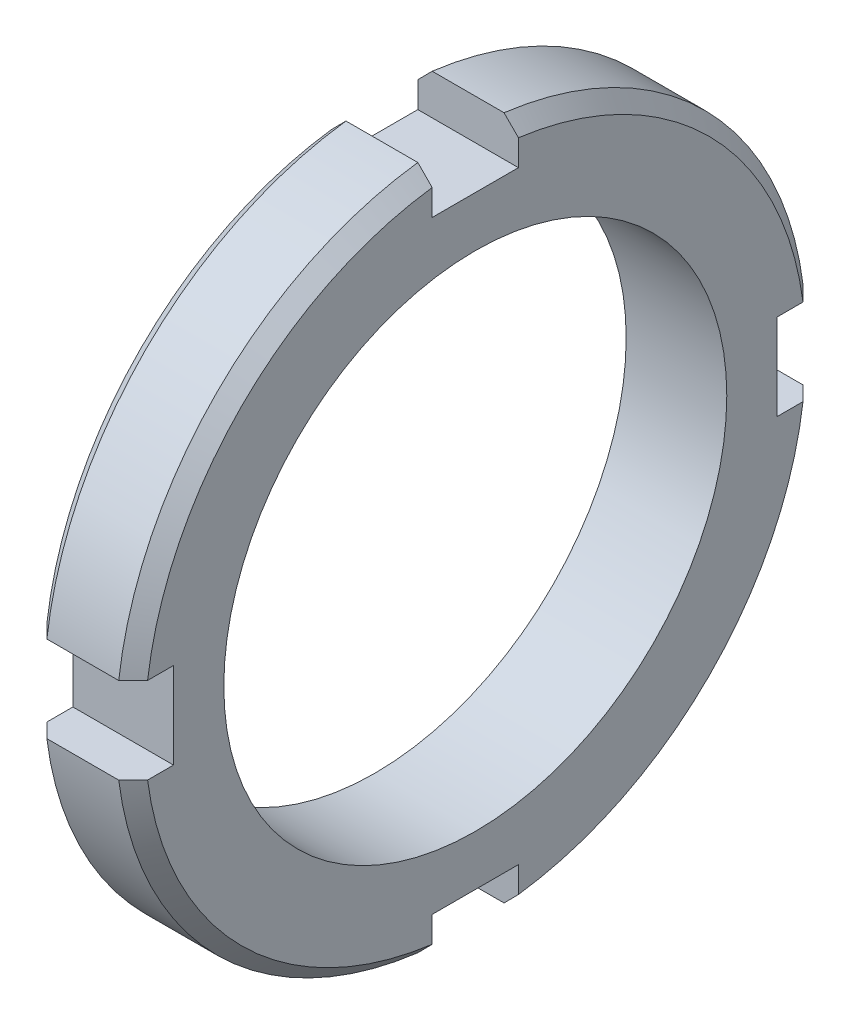
ISO-10303-21;
HEADER;
FILE_DESCRIPTION(('STEP AP214'),'2;1');
FILE_NAME('part.step','',(''),(''),'','','');
FILE_SCHEMA(('AUTOMOTIVE_DESIGN { 1 0 10303 214 1 1 1 1 }'));
ENDSEC;
DATA;
#1=APPLICATION_CONTEXT('core data for automotive mechanical design processes');
#2=APPLICATION_PROTOCOL_DEFINITION('international standard','automotive_design',2000,#1);
#3=PRODUCT_CONTEXT('',#1,'mechanical');
#4=PRODUCT('Part','Part','',(#3));
#5=PRODUCT_RELATED_PRODUCT_CATEGORY('part','',(#4));
#6=PRODUCT_DEFINITION_FORMATION('','',#4);
#7=PRODUCT_DEFINITION_CONTEXT('part definition',#1,'design');
#8=PRODUCT_DEFINITION('design','',#6,#7);
#9=PRODUCT_DEFINITION_SHAPE('','',#8);
#10=(LENGTH_UNIT() NAMED_UNIT(*) SI_UNIT(.MILLI.,.METRE.));
#11=(NAMED_UNIT(*) PLANE_ANGLE_UNIT() SI_UNIT($,.RADIAN.));
#12=(NAMED_UNIT(*) SI_UNIT($,.STERADIAN.) SOLID_ANGLE_UNIT());
#13=UNCERTAINTY_MEASURE_WITH_UNIT(LENGTH_MEASURE(1.E-05),#10,'distance_accuracy_value','');
#14=(GEOMETRIC_REPRESENTATION_CONTEXT(3) GLOBAL_UNCERTAINTY_ASSIGNED_CONTEXT((#13)) GLOBAL_UNIT_ASSIGNED_CONTEXT((#10,
#11,#12)) REPRESENTATION_CONTEXT('',''));
#15=CARTESIAN_POINT('',(0.,0.,0.));
#16=DIRECTION('',(0.,0.,1.));
#17=DIRECTION('',(1.,0.,0.));
#18=AXIS2_PLACEMENT_3D('',#15,#16,#17);
#19=CARTESIAN_POINT('',(0.,17.5,0.));
#20=DIRECTION('',(1.,0.,0.));
#21=DIRECTION('',(0.,0.,-1.));
#22=AXIS2_PLACEMENT_3D('',#19,#20,#21);
#23=PLANE('',#22);
#24=CARTESIAN_POINT('',(0.,0.,0.));
#25=DIRECTION('',(-1.,0.,0.));
#26=DIRECTION('',(0.,0.,1.));
#27=AXIS2_PLACEMENT_3D('',#24,#25,#26);
#28=CIRCLE('',#27,17.5);
#29=CARTESIAN_POINT('',(0.,0.,17.5));
#30=VERTEX_POINT('',#29);
#31=EDGE_CURVE('E211',#30,#30,#28,.T.);
#32=ORIENTED_EDGE('',*,*,#31,.F.);
#33=EDGE_LOOP('',(#32));
#34=FACE_BOUND('',#33,.T.);
#35=DIRECTION('',(0.,0.,1.));
#36=VECTOR('',#35,1.);
#37=CARTESIAN_POINT('',(0.,-3.,0.));
#38=LINE('',#37,#36);
#39=CARTESIAN_POINT('',(0.,-3.,-22.8035085019828));
#40=VERTEX_POINT('',#39);
#41=CARTESIAN_POINT('',(0.,-3.,-21.));
#42=VERTEX_POINT('',#41);
#43=EDGE_CURVE('E258',#40,#42,#38,.T.);
#44=ORIENTED_EDGE('',*,*,#43,.F.);
#45=CARTESIAN_POINT('',(0.,0.,0.));
#46=DIRECTION('',(-1.,0.,0.));
#47=DIRECTION('',(0.,0.,1.));
#48=AXIS2_PLACEMENT_3D('',#45,#46,#47);
#49=CIRCLE('',#48,23.);
#50=CARTESIAN_POINT('',(0.,-22.8035085019828,-3.));
#51=VERTEX_POINT('',#50);
#52=EDGE_CURVE('E300',#40,#51,#49,.T.);
#53=ORIENTED_EDGE('',*,*,#52,.T.);
#54=DIRECTION('',(0.,-1.,0.));
#55=VECTOR('',#54,1.);
#56=CARTESIAN_POINT('',(0.,17.5,-3.));
#57=LINE('',#56,#55);
#58=CARTESIAN_POINT('',(0.,-21.,-3.));
#59=VERTEX_POINT('',#58);
#60=EDGE_CURVE('E504',#59,#51,#57,.T.);
#61=ORIENTED_EDGE('',*,*,#60,.F.);
#62=DIRECTION('',(0.,0.,-1.));
#63=VECTOR('',#62,1.);
#64=CARTESIAN_POINT('',(0.,-21.,0.));
#65=LINE('',#64,#63);
#66=CARTESIAN_POINT('',(0.,-21.,3.));
#67=VERTEX_POINT('',#66);
#68=EDGE_CURVE('E259',#67,#59,#65,.T.);
#69=ORIENTED_EDGE('',*,*,#68,.F.);
#70=DIRECTION('',(0.,1.,0.));
#71=VECTOR('',#70,1.);
#72=CARTESIAN_POINT('',(0.,17.5,3.));
#73=LINE('',#72,#71);
#74=CARTESIAN_POINT('',(0.,-22.8035085019828,3.));
#75=VERTEX_POINT('',#74);
#76=EDGE_CURVE('E218',#75,#67,#73,.T.);
#77=ORIENTED_EDGE('',*,*,#76,.F.);
#78=CARTESIAN_POINT('',(0.,-3.,22.8035085019828));
#79=VERTEX_POINT('',#78);
#80=EDGE_CURVE('E284',#75,#79,#49,.T.);
#81=ORIENTED_EDGE('',*,*,#80,.T.);
#82=DIRECTION('',(0.,0.,1.));
#83=VECTOR('',#82,1.);
#84=CARTESIAN_POINT('',(0.,-3.,0.));
#85=LINE('',#84,#83);
#86=CARTESIAN_POINT('',(0.,-3.,21.));
#87=VERTEX_POINT('',#86);
#88=EDGE_CURVE('E316',#87,#79,#85,.T.);
#89=ORIENTED_EDGE('',*,*,#88,.F.);
#90=DIRECTION('',(0.,-1.,0.));
#91=VECTOR('',#90,1.);
#92=CARTESIAN_POINT('',(0.,17.5,21.));
#93=LINE('',#92,#91);
#94=CARTESIAN_POINT('',(0.,3.,21.));
#95=VERTEX_POINT('',#94);
#96=EDGE_CURVE('E359',#95,#87,#93,.T.);
#97=ORIENTED_EDGE('',*,*,#96,.F.);
#98=DIRECTION('',(0.,0.,-1.));
#99=VECTOR('',#98,1.);
#100=CARTESIAN_POINT('',(0.,3.,0.));
#101=LINE('',#100,#99);
#102=CARTESIAN_POINT('',(0.,3.,22.8035085019828));
#103=VERTEX_POINT('',#102);
#104=EDGE_CURVE('E541',#103,#95,#101,.T.);
#105=ORIENTED_EDGE('',*,*,#104,.F.);
#106=CARTESIAN_POINT('',(0.,22.8035085019828,3.));
#107=VERTEX_POINT('',#106);
#108=EDGE_CURVE('E286',#103,#107,#49,.T.);
#109=ORIENTED_EDGE('',*,*,#108,.T.);
#110=DIRECTION('',(0.,1.,0.));
#111=VECTOR('',#110,1.);
#112=CARTESIAN_POINT('',(0.,17.5,3.));
#113=LINE('',#112,#111);
#114=CARTESIAN_POINT('',(0.,21.,3.));
#115=VERTEX_POINT('',#114);
#116=EDGE_CURVE('E480',#115,#107,#113,.T.);
#117=ORIENTED_EDGE('',*,*,#116,.F.);
#118=DIRECTION('',(0.,0.,1.));
#119=VECTOR('',#118,1.);
#120=CARTESIAN_POINT('',(0.,21.,0.));
#121=LINE('',#120,#119);
#122=CARTESIAN_POINT('',(0.,21.,-3.));
#123=VERTEX_POINT('',#122);
#124=EDGE_CURVE('E494',#123,#115,#121,.T.);
#125=ORIENTED_EDGE('',*,*,#124,.F.);
#126=DIRECTION('',(0.,-1.,0.));
#127=VECTOR('',#126,1.);
#128=CARTESIAN_POINT('',(0.,17.5,-3.));
#129=LINE('',#128,#127);
#130=CARTESIAN_POINT('',(0.,22.8035085019828,-3.));
#131=VERTEX_POINT('',#130);
#132=EDGE_CURVE('E549',#131,#123,#129,.T.);
#133=ORIENTED_EDGE('',*,*,#132,.F.);
#134=CARTESIAN_POINT('',(0.,3.,-22.8035085019828));
#135=VERTEX_POINT('',#134);
#136=EDGE_CURVE('E289',#131,#135,#49,.T.);
#137=ORIENTED_EDGE('',*,*,#136,.T.);
#138=DIRECTION('',(0.,0.,-1.));
#139=VECTOR('',#138,1.);
#140=CARTESIAN_POINT('',(0.,3.,0.));
#141=LINE('',#140,#139);
#142=CARTESIAN_POINT('',(0.,3.,-21.));
#143=VERTEX_POINT('',#142);
#144=EDGE_CURVE('E442',#143,#135,#141,.T.);
#145=ORIENTED_EDGE('',*,*,#144,.F.);
#146=DIRECTION('',(0.,1.,0.));
#147=VECTOR('',#146,1.);
#148=CARTESIAN_POINT('',(0.,17.5,-21.));
#149=LINE('',#148,#147);
#150=EDGE_CURVE('E302',#42,#143,#149,.T.);
#151=ORIENTED_EDGE('',*,*,#150,.F.);
#152=EDGE_LOOP('',(#44,#53,#61,#69,#77,#81,#89,#97,#105,#109,#117,#125,#133,#137,#145,#151));
#153=FACE_BOUND('',#152,.T.);
#154=ADVANCED_FACE('F39',(#34,#153),#23,.F.);
#155=CARTESIAN_POINT('',(1.,0.,0.));
#156=DIRECTION('',(1.,0.,0.));
#157=DIRECTION('',(0.,0.,-1.));
#158=AXIS2_PLACEMENT_3D('',#155,#156,#157);
#159=CONICAL_SURFACE('',#158,24.,0.785398163397449);
#160=CARTESIAN_POINT('',(4.16247766016838,-3.,-26.9962996101159));
#161=CARTESIAN_POINT('',(3.5513634481451,-3.,-26.3814176362449));
#162=CARTESIAN_POINT('',(2.9403713657128,-3.,-25.7664142177015));
#163=CARTESIAN_POINT('',(1.71870574890739,-3.,-24.5360916255063));
#164=CARTESIAN_POINT('',(1.10803221439388,-3.,-23.9207724519938));
#165=CARTESIAN_POINT('',(-0.112922671722353,-3.,-22.6897448260596));
#166=CARTESIAN_POINT('',(-0.72320402325132,-3.,-22.0740363735647));
#167=CARTESIAN_POINT('',(-1.94325481473993,-3.,-20.8421119815848));
#168=CARTESIAN_POINT('',(-2.55302425447197,-3.,-20.2258960418745));
#169=CARTESIAN_POINT('',(-3.16247766016838,-3.,-19.6093674702505));
#170=B_SPLINE_CURVE_WITH_KNOTS('',3,(#160,#161,#162,#163,#164,#165,#166,#167,#168,#169),
.UNSPECIFIED.,.F.,.F.,(4,2,2,2,4),(0.,2.60074297693783,5.20148480668569,7.80222712536961,
10.4029705997262),.UNSPECIFIED.);
#171=CARTESIAN_POINT('',(1.,-3.,-23.8117617995813));
#172=VERTEX_POINT('',#171);
#173=EDGE_CURVE('E303',#172,#40,#170,.T.);
#174=ORIENTED_EDGE('',*,*,#173,.F.);
#175=CARTESIAN_POINT('',(1.,0.,0.));
#176=DIRECTION('',(-1.,0.,0.));
#177=DIRECTION('',(0.,0.,1.));
#178=AXIS2_PLACEMENT_3D('',#175,#176,#177);
#179=CIRCLE('',#178,24.);
#180=CARTESIAN_POINT('',(1.,-23.8117617995813,-3.));
#181=VERTEX_POINT('',#180);
#182=EDGE_CURVE('E602',#172,#181,#179,.T.);
#183=ORIENTED_EDGE('',*,*,#182,.T.);
#184=CARTESIAN_POINT('',(-3.16247766016838,-19.6093674702505,-3.));
#185=CARTESIAN_POINT('',(-2.55302425447197,-20.2258960418745,-3.));
#186=CARTESIAN_POINT('',(-1.94325481473993,-20.8421119815848,-3.));
#187=CARTESIAN_POINT('',(-0.723204023251317,-22.0740363735647,-3.));
#188=CARTESIAN_POINT('',(-0.112922671722349,-22.6897448260596,-3.));
#189=CARTESIAN_POINT('',(1.10803221439388,-23.9207724519938,-3.));
#190=CARTESIAN_POINT('',(1.71870574890739,-24.5360916255063,-3.));
#191=CARTESIAN_POINT('',(2.94037136571281,-25.7664142177015,-3.));
#192=CARTESIAN_POINT('',(3.5513634481451,-26.3814176362449,-3.));
#193=CARTESIAN_POINT('',(4.16247766016838,-26.9962996101159,-3.));
#194=B_SPLINE_CURVE_WITH_KNOTS('',3,(#184,#185,#186,#187,#188,#189,#190,#191,#192,#193),
.UNSPECIFIED.,.F.,.F.,(4,2,2,2,4),(0.,2.60074347435664,5.20148579304056,7.8022276227884,
10.4029705997262),.UNSPECIFIED.);
#195=EDGE_CURVE('E310',#51,#181,#194,.T.);
#196=ORIENTED_EDGE('',*,*,#195,.F.);
#197=ORIENTED_EDGE('',*,*,#52,.F.);
#198=EDGE_LOOP('',(#174,#183,#196,#197));
#199=FACE_BOUND('',#198,.T.);
#200=ADVANCED_FACE('F296',(#199),#159,.T.);
#201=CARTESIAN_POINT('',(-3.16247766016838,3.,-19.6093674702505));
#202=CARTESIAN_POINT('',(-2.55302425447197,3.,-20.2258960418745));
#203=CARTESIAN_POINT('',(-1.94325481473992,3.,-20.8421119815848));
#204=CARTESIAN_POINT('',(-0.723204023251314,3.,-22.0740363735647));
#205=CARTESIAN_POINT('',(-0.112922671722347,3.,-22.6897448260596));
#206=CARTESIAN_POINT('',(1.10803221439389,3.,-23.9207724519938));
#207=CARTESIAN_POINT('',(1.7187057489074,3.,-24.5360916255063));
#208=CARTESIAN_POINT('',(2.94037136571281,3.,-25.7664142177016));
#209=CARTESIAN_POINT('',(3.5513634481451,3.,-26.3814176362449));
#210=CARTESIAN_POINT('',(4.16247766016838,3.,-26.9962996101159));
#211=B_SPLINE_CURVE_WITH_KNOTS('',3,(#201,#202,#203,#204,#205,#206,#207,#208,#209,#210),
.UNSPECIFIED.,.F.,.F.,(4,2,2,2,4),(0.,2.60074347435664,5.20148579304056,7.80222762278841,
10.4029705997262),.UNSPECIFIED.);
#212=CARTESIAN_POINT('',(1.,3.,-23.8117617995813));
#213=VERTEX_POINT('',#212);
#214=EDGE_CURVE('E436',#135,#213,#211,.T.);
#215=ORIENTED_EDGE('',*,*,#214,.F.);
#216=ORIENTED_EDGE('',*,*,#136,.F.);
#217=CARTESIAN_POINT('',(4.16247766016838,26.9962996101159,-3.));
#218=CARTESIAN_POINT('',(3.5513634481451,26.3814176362449,-3.));
#219=CARTESIAN_POINT('',(2.9403713657128,25.7664142177015,-3.));
#220=CARTESIAN_POINT('',(1.71870574890739,24.5360916255063,-3.));
#221=CARTESIAN_POINT('',(1.10803221439388,23.9207724519938,-3.));
#222=CARTESIAN_POINT('',(-0.112922671722353,22.6897448260596,-3.));
#223=CARTESIAN_POINT('',(-0.72320402325132,22.0740363735647,-3.));
#224=CARTESIAN_POINT('',(-1.94325481473993,20.8421119815848,-3.));
#225=CARTESIAN_POINT('',(-2.55302425447197,20.2258960418745,-3.));
#226=CARTESIAN_POINT('',(-3.16247766016838,19.6093674702505,-3.));
#227=B_SPLINE_CURVE_WITH_KNOTS('',3,(#217,#218,#219,#220,#221,#222,#223,#224,#225,#226),
.UNSPECIFIED.,.F.,.F.,(4,2,2,2,4),(0.,2.60074297693783,5.20148480668569,7.80222712536961,
10.4029705997262),.UNSPECIFIED.);
#228=CARTESIAN_POINT('',(1.,23.8117617995813,-3.));
#229=VERTEX_POINT('',#228);
#230=EDGE_CURVE('E550',#229,#131,#227,.T.);
#231=ORIENTED_EDGE('',*,*,#230,.F.);
#232=EDGE_CURVE('E285',#229,#213,#179,.T.);
#233=ORIENTED_EDGE('',*,*,#232,.T.);
#234=EDGE_LOOP('',(#215,#216,#231,#233));
#235=FACE_BOUND('',#234,.T.);
#236=ADVANCED_FACE('F568',(#235),#159,.T.);
#237=CARTESIAN_POINT('',(-3.16247766016838,-3.,19.6093674702505));
#238=CARTESIAN_POINT('',(-2.55302425447197,-3.,20.2258960418745));
#239=CARTESIAN_POINT('',(-1.94325481473993,-3.,20.8421119815848));
#240=CARTESIAN_POINT('',(-0.723204023251317,-3.,22.0740363735647));
#241=CARTESIAN_POINT('',(-0.112922671722349,-3.,22.6897448260596));
#242=CARTESIAN_POINT('',(1.10803221439388,-3.,23.9207724519938));
#243=CARTESIAN_POINT('',(1.71870574890739,-3.,24.5360916255063));
#244=CARTESIAN_POINT('',(2.94037136571281,-3.,25.7664142177015));
#245=CARTESIAN_POINT('',(3.5513634481451,-3.,26.3814176362449));
#246=CARTESIAN_POINT('',(4.16247766016838,-3.,26.9962996101159));
#247=B_SPLINE_CURVE_WITH_KNOTS('',3,(#237,#238,#239,#240,#241,#242,#243,#244,#245,#246),
.UNSPECIFIED.,.F.,.F.,(4,2,2,2,4),(0.,2.60074347435664,5.20148579304056,7.8022276227884,
10.4029705997262),.UNSPECIFIED.);
#248=CARTESIAN_POINT('',(1.,-3.,23.8117617995813));
#249=VERTEX_POINT('',#248);
#250=EDGE_CURVE('E324',#79,#249,#247,.T.);
#251=ORIENTED_EDGE('',*,*,#250,.F.);
#252=ORIENTED_EDGE('',*,*,#80,.F.);
#253=CARTESIAN_POINT('',(4.16247766016838,-26.9962996101159,3.));
#254=CARTESIAN_POINT('',(3.5513634481451,-26.3814176362449,3.));
#255=CARTESIAN_POINT('',(2.94037136571281,-25.7664142177015,3.));
#256=CARTESIAN_POINT('',(1.71870574890739,-24.5360916255063,3.));
#257=CARTESIAN_POINT('',(1.10803221439388,-23.9207724519938,3.));
#258=CARTESIAN_POINT('',(-0.11292267172235,-22.6897448260596,3.));
#259=CARTESIAN_POINT('',(-0.723204023251319,-22.0740363735647,3.));
#260=CARTESIAN_POINT('',(-1.94325481473993,-20.8421119815848,3.));
#261=CARTESIAN_POINT('',(-2.55302425447198,-20.2258960418745,3.));
#262=CARTESIAN_POINT('',(-3.16247766016838,-19.6093674702505,3.));
#263=B_SPLINE_CURVE_WITH_KNOTS('',3,(#253,#254,#255,#256,#257,#258,#259,#260,#261,#262),
.UNSPECIFIED.,.F.,.F.,(4,2,2,2,4),(0.,2.60074297693784,5.20148480668569,7.80222712536961,
10.4029705997262),.UNSPECIFIED.);
#264=CARTESIAN_POINT('',(1.,-23.8117617995813,3.));
#265=VERTEX_POINT('',#264);
#266=EDGE_CURVE('E322',#265,#75,#263,.T.);
#267=ORIENTED_EDGE('',*,*,#266,.F.);
#268=EDGE_CURVE('E279',#265,#249,#179,.T.);
#269=ORIENTED_EDGE('',*,*,#268,.T.);
#270=EDGE_LOOP('',(#251,#252,#267,#269));
#271=FACE_BOUND('',#270,.T.);
#272=ADVANCED_FACE('F320',(#271),#159,.T.);
#273=CARTESIAN_POINT('',(4.16247766016838,3.,26.9962996101159));
#274=CARTESIAN_POINT('',(3.5513634481451,3.,26.3814176362449));
#275=CARTESIAN_POINT('',(2.94037136571281,3.,25.7664142177015));
#276=CARTESIAN_POINT('',(1.71870574890739,3.,24.5360916255063));
#277=CARTESIAN_POINT('',(1.10803221439388,3.,23.9207724519938));
#278=CARTESIAN_POINT('',(-0.11292267172235,3.,22.6897448260596));
#279=CARTESIAN_POINT('',(-0.723204023251319,3.,22.0740363735647));
#280=CARTESIAN_POINT('',(-1.94325481473993,3.,20.8421119815848));
#281=CARTESIAN_POINT('',(-2.55302425447198,3.,20.2258960418745));
#282=CARTESIAN_POINT('',(-3.16247766016838,3.,19.6093674702505));
#283=B_SPLINE_CURVE_WITH_KNOTS('',3,(#273,#274,#275,#276,#277,#278,#279,#280,#281,#282),
.UNSPECIFIED.,.F.,.F.,(4,2,2,2,4),(0.,2.60074297693784,5.20148480668569,7.80222712536961,
10.4029705997262),.UNSPECIFIED.);
#284=CARTESIAN_POINT('',(1.,3.,23.8117617995813));
#285=VERTEX_POINT('',#284);
#286=EDGE_CURVE('E542',#285,#103,#283,.T.);
#287=ORIENTED_EDGE('',*,*,#286,.F.);
#288=CARTESIAN_POINT('',(1.,23.8117617995813,3.));
#289=VERTEX_POINT('',#288);
#290=EDGE_CURVE('E281',#285,#289,#179,.T.);
#291=ORIENTED_EDGE('',*,*,#290,.T.);
#292=CARTESIAN_POINT('',(-3.16247766016838,19.6093674702505,3.));
#293=CARTESIAN_POINT('',(-2.55302425447197,20.2258960418745,3.));
#294=CARTESIAN_POINT('',(-1.94325481473992,20.8421119815848,3.));
#295=CARTESIAN_POINT('',(-0.723204023251314,22.0740363735647,3.));
#296=CARTESIAN_POINT('',(-0.112922671722347,22.6897448260596,3.));
#297=CARTESIAN_POINT('',(1.10803221439389,23.9207724519938,3.));
#298=CARTESIAN_POINT('',(1.7187057489074,24.5360916255063,3.));
#299=CARTESIAN_POINT('',(2.94037136571281,25.7664142177016,3.));
#300=CARTESIAN_POINT('',(3.5513634481451,26.3814176362449,3.));
#301=CARTESIAN_POINT('',(4.16247766016838,26.9962996101159,3.));
#302=B_SPLINE_CURVE_WITH_KNOTS('',3,(#292,#293,#294,#295,#296,#297,#298,#299,#300,#301),
.UNSPECIFIED.,.F.,.F.,(4,2,2,2,4),(0.,2.60074347435664,5.20148579304056,7.80222762278841,
10.4029705997262),.UNSPECIFIED.);
#303=EDGE_CURVE('E527',#107,#289,#302,.T.);
#304=ORIENTED_EDGE('',*,*,#303,.F.);
#305=ORIENTED_EDGE('',*,*,#108,.F.);
#306=EDGE_LOOP('',(#287,#291,#304,#305));
#307=FACE_BOUND('',#306,.T.);
#308=ADVANCED_FACE('F538',(#307),#159,.T.);
#309=CARTESIAN_POINT('',(-5.,0.,0.));
#310=DIRECTION('',(-1.,0.,0.));
#311=DIRECTION('',(0.,0.,1.));
#312=AXIS2_PLACEMENT_3D('',#309,#310,#311);
#313=CYLINDRICAL_SURFACE('',#312,24.);
#314=DIRECTION('',(-1.,0.,0.));
#315=VECTOR('',#314,1.);
#316=CARTESIAN_POINT('',(-5.,-3.,-23.8117617995813));
#317=LINE('',#316,#315);
#318=CARTESIAN_POINT('',(6.,-3.,-23.8117617995813));
#319=VERTEX_POINT('',#318);
#320=EDGE_CURVE('E449',#319,#172,#317,.T.);
#321=ORIENTED_EDGE('',*,*,#320,.F.);
#322=CARTESIAN_POINT('',(6.,0.,0.));
#323=DIRECTION('',(-1.,0.,0.));
#324=DIRECTION('',(0.,0.,1.));
#325=AXIS2_PLACEMENT_3D('',#322,#323,#324);
#326=CIRCLE('',#325,24.);
#327=CARTESIAN_POINT('',(6.,-23.8117617995813,-3.));
#328=VERTEX_POINT('',#327);
#329=EDGE_CURVE('E580',#319,#328,#326,.T.);
#330=ORIENTED_EDGE('',*,*,#329,.T.);
#331=DIRECTION('',(-1.,0.,0.));
#332=VECTOR('',#331,1.);
#333=CARTESIAN_POINT('',(-5.,-23.8117617995813,-3.));
#334=LINE('',#333,#332);
#335=EDGE_CURVE('E501',#181,#328,#334,.F.);
#336=ORIENTED_EDGE('',*,*,#335,.F.);
#337=ORIENTED_EDGE('',*,*,#182,.F.);
#338=EDGE_LOOP('',(#321,#330,#336,#337));
#339=FACE_BOUND('',#338,.T.);
#340=ADVANCED_FACE('F369',(#339),#313,.T.);
#341=DIRECTION('',(-1.,0.,0.));
#342=VECTOR('',#341,1.);
#343=CARTESIAN_POINT('',(-5.,3.,-23.8117617995813));
#344=LINE('',#343,#342);
#345=CARTESIAN_POINT('',(6.,3.,-23.8117617995813));
#346=VERTEX_POINT('',#345);
#347=EDGE_CURVE('E428',#213,#346,#344,.F.);
#348=ORIENTED_EDGE('',*,*,#347,.F.);
#349=ORIENTED_EDGE('',*,*,#232,.F.);
#350=DIRECTION('',(-1.,0.,0.));
#351=VECTOR('',#350,1.);
#352=CARTESIAN_POINT('',(-5.,23.8117617995813,-3.));
#353=LINE('',#352,#351);
#354=CARTESIAN_POINT('',(6.,23.8117617995813,-3.));
#355=VERTEX_POINT('',#354);
#356=EDGE_CURVE('E557',#355,#229,#353,.T.);
#357=ORIENTED_EDGE('',*,*,#356,.F.);
#358=EDGE_CURVE('E280',#355,#346,#326,.T.);
#359=ORIENTED_EDGE('',*,*,#358,.T.);
#360=EDGE_LOOP('',(#348,#349,#357,#359));
#361=FACE_BOUND('',#360,.T.);
#362=ADVANCED_FACE('F575',(#361),#313,.T.);
#363=DIRECTION('',(-1.,0.,0.));
#364=VECTOR('',#363,1.);
#365=CARTESIAN_POINT('',(-5.,-3.,23.8117617995813));
#366=LINE('',#365,#364);
#367=CARTESIAN_POINT('',(6.,-3.,23.8117617995813));
#368=VERTEX_POINT('',#367);
#369=EDGE_CURVE('E327',#249,#368,#366,.F.);
#370=ORIENTED_EDGE('',*,*,#369,.F.);
#371=ORIENTED_EDGE('',*,*,#268,.F.);
#372=DIRECTION('',(-1.,0.,0.));
#373=VECTOR('',#372,1.);
#374=CARTESIAN_POINT('',(-5.,-23.8117617995813,3.));
#375=LINE('',#374,#373);
#376=CARTESIAN_POINT('',(6.,-23.8117617995813,3.));
#377=VERTEX_POINT('',#376);
#378=EDGE_CURVE('E590',#377,#265,#375,.T.);
#379=ORIENTED_EDGE('',*,*,#378,.F.);
#380=EDGE_CURVE('E274',#377,#368,#326,.T.);
#381=ORIENTED_EDGE('',*,*,#380,.T.);
#382=EDGE_LOOP('',(#370,#371,#379,#381));
#383=FACE_BOUND('',#382,.T.);
#384=ADVANCED_FACE('F589',(#383),#313,.T.);
#385=DIRECTION('',(-1.,0.,0.));
#386=VECTOR('',#385,1.);
#387=CARTESIAN_POINT('',(-5.,3.,23.8117617995813));
#388=LINE('',#387,#386);
#389=CARTESIAN_POINT('',(6.,3.,23.8117617995813));
#390=VERTEX_POINT('',#389);
#391=EDGE_CURVE('E479',#390,#285,#388,.T.);
#392=ORIENTED_EDGE('',*,*,#391,.F.);
#393=CARTESIAN_POINT('',(6.,23.8117617995813,3.));
#394=VERTEX_POINT('',#393);
#395=EDGE_CURVE('E276',#390,#394,#326,.T.);
#396=ORIENTED_EDGE('',*,*,#395,.T.);
#397=DIRECTION('',(-1.,0.,0.));
#398=VECTOR('',#397,1.);
#399=CARTESIAN_POINT('',(-5.,23.8117617995813,3.));
#400=LINE('',#399,#398);
#401=EDGE_CURVE('E532',#289,#394,#400,.F.);
#402=ORIENTED_EDGE('',*,*,#401,.F.);
#403=ORIENTED_EDGE('',*,*,#290,.F.);
#404=EDGE_LOOP('',(#392,#396,#402,#403));
#405=FACE_BOUND('',#404,.T.);
#406=ADVANCED_FACE('F366',(#405),#313,.T.);
#407=CARTESIAN_POINT('',(7.,0.,0.));
#408=DIRECTION('',(-1.,0.,0.));
#409=DIRECTION('',(0.,0.,1.));
#410=AXIS2_PLACEMENT_3D('',#407,#408,#409);
#411=CONICAL_SURFACE('',#410,23.,0.785398163397448);
#412=CARTESIAN_POINT('',(10.1624776601684,-3.,-19.6093674702505));
#413=CARTESIAN_POINT('',(9.55302425447197,-3.,-20.2258960418745));
#414=CARTESIAN_POINT('',(8.94325481473992,-3.,-20.8421119815848));
#415=CARTESIAN_POINT('',(7.72320402325131,-3.,-22.0740363735647));
#416=CARTESIAN_POINT('',(7.11292267172235,-3.,-22.6897448260596));
#417=CARTESIAN_POINT('',(5.89196778560611,-3.,-23.9207724519938));
#418=CARTESIAN_POINT('',(5.2812942510926,-3.,-24.5360916255063));
#419=CARTESIAN_POINT('',(4.05962863428719,-3.,-25.7664142177015));
#420=CARTESIAN_POINT('',(3.4486365518549,-3.,-26.3814176362449));
#421=CARTESIAN_POINT('',(2.83752233983162,-3.,-26.9962996101159));
#422=B_SPLINE_CURVE_WITH_KNOTS('',3,(#412,#413,#414,#415,#416,#417,#418,#419,#420,#421),
.UNSPECIFIED.,.F.,.F.,(4,2,2,2,4),(0.,2.60074347435664,5.20148579304056,7.80222762278841,
10.4029705997262),.UNSPECIFIED.);
#423=CARTESIAN_POINT('',(7.,-3.,-22.8035085019828));
#424=VERTEX_POINT('',#423);
#425=EDGE_CURVE('E443',#424,#319,#422,.T.);
#426=ORIENTED_EDGE('',*,*,#425,.F.);
#427=CARTESIAN_POINT('',(7.,0.,0.));
#428=DIRECTION('',(-1.,0.,0.));
#429=DIRECTION('',(0.,0.,1.));
#430=AXIS2_PLACEMENT_3D('',#427,#428,#429);
#431=CIRCLE('',#430,23.);
#432=CARTESIAN_POINT('',(7.,-22.8035085019828,-3.));
#433=VERTEX_POINT('',#432);
#434=EDGE_CURVE('E263',#424,#433,#431,.T.);
#435=ORIENTED_EDGE('',*,*,#434,.T.);
#436=CARTESIAN_POINT('',(2.83752233983162,-26.9962996101159,-3.));
#437=CARTESIAN_POINT('',(3.4486365518549,-26.3814176362449,-3.));
#438=CARTESIAN_POINT('',(4.05962863428719,-25.7664142177015,-3.));
#439=CARTESIAN_POINT('',(5.2812942510926,-24.5360916255063,-3.));
#440=CARTESIAN_POINT('',(5.89196778560612,-23.9207724519938,-3.));
#441=CARTESIAN_POINT('',(7.11292267172235,-22.6897448260596,-3.));
#442=CARTESIAN_POINT('',(7.72320402325132,-22.0740363735647,-3.));
#443=CARTESIAN_POINT('',(8.94325481473993,-20.8421119815848,-3.));
#444=CARTESIAN_POINT('',(9.55302425447197,-20.2258960418745,-3.));
#445=CARTESIAN_POINT('',(10.1624776601684,-19.6093674702505,-3.));
#446=B_SPLINE_CURVE_WITH_KNOTS('',3,(#436,#437,#438,#439,#440,#441,#442,#443,#444,#445),
.UNSPECIFIED.,.F.,.F.,(4,2,2,2,4),(0.,2.60074297693783,5.20148480668568,7.80222712536961,
10.4029705997262),.UNSPECIFIED.);
#447=EDGE_CURVE('E373',#328,#433,#446,.T.);
#448=ORIENTED_EDGE('',*,*,#447,.F.);
#449=ORIENTED_EDGE('',*,*,#329,.F.);
#450=EDGE_LOOP('',(#426,#435,#448,#449));
#451=FACE_BOUND('',#450,.T.);
#452=ADVANCED_FACE('F361',(#451),#411,.T.);
#453=CARTESIAN_POINT('',(2.83752233983162,3.,-26.9962996101159));
#454=CARTESIAN_POINT('',(3.4486365518549,3.,-26.3814176362449));
#455=CARTESIAN_POINT('',(4.05962863428719,3.,-25.7664142177015));
#456=CARTESIAN_POINT('',(5.28129425109261,3.,-24.5360916255063));
#457=CARTESIAN_POINT('',(5.89196778560612,3.,-23.9207724519938));
#458=CARTESIAN_POINT('',(7.11292267172235,3.,-22.6897448260596));
#459=CARTESIAN_POINT('',(7.72320402325132,3.,-22.0740363735647));
#460=CARTESIAN_POINT('',(8.94325481473993,3.,-20.8421119815848));
#461=CARTESIAN_POINT('',(9.55302425447197,3.,-20.2258960418745));
#462=CARTESIAN_POINT('',(10.1624776601684,3.,-19.6093674702505));
#463=B_SPLINE_CURVE_WITH_KNOTS('',3,(#453,#454,#455,#456,#457,#458,#459,#460,#461,#462),
.UNSPECIFIED.,.F.,.F.,(4,2,2,2,4),(0.,2.60074297693783,5.20148480668568,7.8022271253696,
10.4029705997262),.UNSPECIFIED.);
#464=CARTESIAN_POINT('',(7.,3.,-22.8035085019828));
#465=VERTEX_POINT('',#464);
#466=EDGE_CURVE('E329',#346,#465,#463,.T.);
#467=ORIENTED_EDGE('',*,*,#466,.F.);
#468=ORIENTED_EDGE('',*,*,#358,.F.);
#469=CARTESIAN_POINT('',(10.1624776601684,19.6093674702505,-3.));
#470=CARTESIAN_POINT('',(9.55302425447197,20.2258960418745,-3.));
#471=CARTESIAN_POINT('',(8.94325481473992,20.8421119815848,-3.));
#472=CARTESIAN_POINT('',(7.72320402325131,22.0740363735647,-3.));
#473=CARTESIAN_POINT('',(7.11292267172235,22.6897448260596,-3.));
#474=CARTESIAN_POINT('',(5.89196778560611,23.9207724519938,-3.));
#475=CARTESIAN_POINT('',(5.2812942510926,24.5360916255063,-3.));
#476=CARTESIAN_POINT('',(4.05962863428719,25.7664142177015,-3.));
#477=CARTESIAN_POINT('',(3.4486365518549,26.3814176362449,-3.));
#478=CARTESIAN_POINT('',(2.83752233983162,26.9962996101159,-3.));
#479=B_SPLINE_CURVE_WITH_KNOTS('',3,(#469,#470,#471,#472,#473,#474,#475,#476,#477,#478),
.UNSPECIFIED.,.F.,.F.,(4,2,2,2,4),(0.,2.60074347435664,5.20148579304056,7.80222762278841,
10.4029705997262),.UNSPECIFIED.);
#480=CARTESIAN_POINT('',(7.,22.8035085019828,-3.));
#481=VERTEX_POINT('',#480);
#482=EDGE_CURVE('E395',#481,#355,#479,.T.);
#483=ORIENTED_EDGE('',*,*,#482,.F.);
#484=EDGE_CURVE('E266',#481,#465,#431,.T.);
#485=ORIENTED_EDGE('',*,*,#484,.T.);
#486=EDGE_LOOP('',(#467,#468,#483,#485));
#487=FACE_BOUND('',#486,.T.);
#488=ADVANCED_FACE('F365',(#487),#411,.T.);
#489=CARTESIAN_POINT('',(2.83752233983162,-3.,26.9962996101159));
#490=CARTESIAN_POINT('',(3.4486365518549,-3.,26.3814176362449));
#491=CARTESIAN_POINT('',(4.05962863428719,-3.,25.7664142177015));
#492=CARTESIAN_POINT('',(5.2812942510926,-3.,24.5360916255063));
#493=CARTESIAN_POINT('',(5.89196778560612,-3.,23.9207724519938));
#494=CARTESIAN_POINT('',(7.11292267172235,-3.,22.6897448260596));
#495=CARTESIAN_POINT('',(7.72320402325132,-3.,22.0740363735647));
#496=CARTESIAN_POINT('',(8.94325481473993,-3.,20.8421119815848));
#497=CARTESIAN_POINT('',(9.55302425447197,-3.,20.2258960418745));
#498=CARTESIAN_POINT('',(10.1624776601684,-3.,19.6093674702505));
#499=B_SPLINE_CURVE_WITH_KNOTS('',3,(#489,#490,#491,#492,#493,#494,#495,#496,#497,#498),
.UNSPECIFIED.,.F.,.F.,(4,2,2,2,4),(0.,2.60074297693783,5.20148480668568,7.80222712536961,
10.4029705997262),.UNSPECIFIED.);
#500=CARTESIAN_POINT('',(7.,-3.,22.8035085019828));
#501=VERTEX_POINT('',#500);
#502=EDGE_CURVE('E331',#368,#501,#499,.T.);
#503=ORIENTED_EDGE('',*,*,#502,.F.);
#504=ORIENTED_EDGE('',*,*,#380,.F.);
#505=CARTESIAN_POINT('',(10.1624776601684,-19.6093674702505,3.));
#506=CARTESIAN_POINT('',(9.55302425447197,-20.2258960418745,3.));
#507=CARTESIAN_POINT('',(8.94325481473993,-20.8421119815848,3.));
#508=CARTESIAN_POINT('',(7.72320402325132,-22.0740363735647,3.));
#509=CARTESIAN_POINT('',(7.11292267172235,-22.6897448260596,3.));
#510=CARTESIAN_POINT('',(5.89196778560612,-23.9207724519938,3.));
#511=CARTESIAN_POINT('',(5.2812942510926,-24.5360916255063,3.));
#512=CARTESIAN_POINT('',(4.05962863428719,-25.7664142177015,3.));
#513=CARTESIAN_POINT('',(3.4486365518549,-26.3814176362449,3.));
#514=CARTESIAN_POINT('',(2.83752233983162,-26.9962996101159,3.));
#515=B_SPLINE_CURVE_WITH_KNOTS('',3,(#505,#506,#507,#508,#509,#510,#511,#512,#513,#514),
.UNSPECIFIED.,.F.,.F.,(4,2,2,2,4),(0.,2.60074347435664,5.20148579304055,7.8022276227884,
10.4029705997262),.UNSPECIFIED.);
#516=CARTESIAN_POINT('',(7.,-22.8035085019828,3.));
#517=VERTEX_POINT('',#516);
#518=EDGE_CURVE('E385',#517,#377,#515,.T.);
#519=ORIENTED_EDGE('',*,*,#518,.F.);
#520=EDGE_CURVE('E226',#517,#501,#431,.T.);
#521=ORIENTED_EDGE('',*,*,#520,.T.);
#522=EDGE_LOOP('',(#503,#504,#519,#521));
#523=FACE_BOUND('',#522,.T.);
#524=ADVANCED_FACE('F468',(#523),#411,.T.);
#525=CARTESIAN_POINT('',(10.1624776601684,3.,19.6093674702505));
#526=CARTESIAN_POINT('',(9.55302425447197,3.,20.2258960418745));
#527=CARTESIAN_POINT('',(8.94325481473993,3.,20.8421119815848));
#528=CARTESIAN_POINT('',(7.72320402325132,3.,22.0740363735647));
#529=CARTESIAN_POINT('',(7.11292267172235,3.,22.6897448260596));
#530=CARTESIAN_POINT('',(5.89196778560612,3.,23.9207724519938));
#531=CARTESIAN_POINT('',(5.2812942510926,3.,24.5360916255063));
#532=CARTESIAN_POINT('',(4.05962863428719,3.,25.7664142177015));
#533=CARTESIAN_POINT('',(3.4486365518549,3.,26.3814176362449));
#534=CARTESIAN_POINT('',(2.83752233983162,3.,26.9962996101159));
#535=B_SPLINE_CURVE_WITH_KNOTS('',3,(#525,#526,#527,#528,#529,#530,#531,#532,#533,#534),
.UNSPECIFIED.,.F.,.F.,(4,2,2,2,4),(0.,2.60074347435664,5.20148579304055,7.8022276227884,
10.4029705997262),.UNSPECIFIED.);
#536=CARTESIAN_POINT('',(7.,3.,22.8035085019828));
#537=VERTEX_POINT('',#536);
#538=EDGE_CURVE('E415',#537,#390,#535,.T.);
#539=ORIENTED_EDGE('',*,*,#538,.F.);
#540=CARTESIAN_POINT('',(7.,22.8035085019828,3.));
#541=VERTEX_POINT('',#540);
#542=EDGE_CURVE('E269',#537,#541,#431,.T.);
#543=ORIENTED_EDGE('',*,*,#542,.T.);
#544=CARTESIAN_POINT('',(2.83752233983162,26.9962996101159,3.));
#545=CARTESIAN_POINT('',(3.4486365518549,26.3814176362449,3.));
#546=CARTESIAN_POINT('',(4.05962863428719,25.7664142177015,3.));
#547=CARTESIAN_POINT('',(5.28129425109261,24.5360916255063,3.));
#548=CARTESIAN_POINT('',(5.89196778560612,23.9207724519938,3.));
#549=CARTESIAN_POINT('',(7.11292267172235,22.6897448260596,3.));
#550=CARTESIAN_POINT('',(7.72320402325132,22.0740363735647,3.));
#551=CARTESIAN_POINT('',(8.94325481473993,20.8421119815848,3.));
#552=CARTESIAN_POINT('',(9.55302425447197,20.2258960418745,3.));
#553=CARTESIAN_POINT('',(10.1624776601684,19.6093674702505,3.));
#554=B_SPLINE_CURVE_WITH_KNOTS('',3,(#544,#545,#546,#547,#548,#549,#550,#551,#552,#553),
.UNSPECIFIED.,.F.,.F.,(4,2,2,2,4),(0.,2.60074297693783,5.20148480668568,7.8022271253696,
10.4029705997262),.UNSPECIFIED.);
#555=EDGE_CURVE('E405',#394,#541,#554,.T.);
#556=ORIENTED_EDGE('',*,*,#555,.F.);
#557=ORIENTED_EDGE('',*,*,#395,.F.);
#558=EDGE_LOOP('',(#539,#543,#556,#557));
#559=FACE_BOUND('',#558,.T.);
#560=ADVANCED_FACE('F367',(#559),#411,.T.);
#561=CARTESIAN_POINT('',(7.,23.,0.));
#562=DIRECTION('',(-1.,0.,0.));
#563=DIRECTION('',(0.,0.,1.));
#564=AXIS2_PLACEMENT_3D('',#561,#562,#563);
#565=PLANE('',#564);
#566=CARTESIAN_POINT('',(7.,0.,0.));
#567=DIRECTION('',(-1.,0.,0.));
#568=DIRECTION('',(0.,0.,1.));
#569=AXIS2_PLACEMENT_3D('',#566,#567,#568);
#570=CIRCLE('',#569,17.5);
#571=CARTESIAN_POINT('',(7.,0.,17.5));
#572=VERTEX_POINT('',#571);
#573=EDGE_CURVE('E270',#572,#572,#570,.T.);
#574=ORIENTED_EDGE('',*,*,#573,.T.);
#575=EDGE_LOOP('',(#574));
#576=FACE_BOUND('',#575,.T.);
#577=DIRECTION('',(0.,0.,-1.));
#578=VECTOR('',#577,1.);
#579=CARTESIAN_POINT('',(7.,-3.,0.));
#580=LINE('',#579,#578);
#581=CARTESIAN_POINT('',(7.,-3.,-21.));
#582=VERTEX_POINT('',#581);
#583=EDGE_CURVE('E11',#582,#424,#580,.T.);
#584=ORIENTED_EDGE('',*,*,#583,.F.);
#585=DIRECTION('',(0.,-1.,0.));
#586=VECTOR('',#585,1.);
#587=CARTESIAN_POINT('',(7.,23.,-21.));
#588=LINE('',#587,#586);
#589=CARTESIAN_POINT('',(7.,3.,-21.));
#590=VERTEX_POINT('',#589);
#591=EDGE_CURVE('E47',#590,#582,#588,.T.);
#592=ORIENTED_EDGE('',*,*,#591,.F.);
#593=DIRECTION('',(0.,0.,1.));
#594=VECTOR('',#593,1.);
#595=CARTESIAN_POINT('',(7.,3.,0.));
#596=LINE('',#595,#594);
#597=EDGE_CURVE('E242',#465,#590,#596,.T.);
#598=ORIENTED_EDGE('',*,*,#597,.F.);
#599=ORIENTED_EDGE('',*,*,#484,.F.);
#600=DIRECTION('',(0.,1.,0.));
#601=VECTOR('',#600,1.);
#602=CARTESIAN_POINT('',(7.,23.,-3.));
#603=LINE('',#602,#601);
#604=CARTESIAN_POINT('',(7.,21.,-3.));
#605=VERTEX_POINT('',#604);
#606=EDGE_CURVE('E227',#605,#481,#603,.T.);
#607=ORIENTED_EDGE('',*,*,#606,.F.);
#608=DIRECTION('',(0.,0.,-1.));
#609=VECTOR('',#608,1.);
#610=CARTESIAN_POINT('',(7.,21.,0.));
#611=LINE('',#610,#609);
#612=CARTESIAN_POINT('',(7.,21.,3.));
#613=VERTEX_POINT('',#612);
#614=EDGE_CURVE('E229',#613,#605,#611,.T.);
#615=ORIENTED_EDGE('',*,*,#614,.F.);
#616=DIRECTION('',(0.,-1.,0.));
#617=VECTOR('',#616,1.);
#618=CARTESIAN_POINT('',(7.,23.,3.));
#619=LINE('',#618,#617);
#620=EDGE_CURVE('E234',#541,#613,#619,.T.);
#621=ORIENTED_EDGE('',*,*,#620,.F.);
#622=ORIENTED_EDGE('',*,*,#542,.F.);
#623=DIRECTION('',(0.,0.,1.));
#624=VECTOR('',#623,1.);
#625=CARTESIAN_POINT('',(7.,3.,0.));
#626=LINE('',#625,#624);
#627=CARTESIAN_POINT('',(7.,3.,21.));
#628=VERTEX_POINT('',#627);
#629=EDGE_CURVE('E236',#628,#537,#626,.T.);
#630=ORIENTED_EDGE('',*,*,#629,.F.);
#631=DIRECTION('',(0.,1.,0.));
#632=VECTOR('',#631,1.);
#633=CARTESIAN_POINT('',(7.,23.,21.));
#634=LINE('',#633,#632);
#635=CARTESIAN_POINT('',(7.,-3.,21.));
#636=VERTEX_POINT('',#635);
#637=EDGE_CURVE('E238',#636,#628,#634,.T.);
#638=ORIENTED_EDGE('',*,*,#637,.F.);
#639=DIRECTION('',(0.,0.,-1.));
#640=VECTOR('',#639,1.);
#641=CARTESIAN_POINT('',(7.,-3.,0.));
#642=LINE('',#641,#640);
#643=EDGE_CURVE('E240',#501,#636,#642,.T.);
#644=ORIENTED_EDGE('',*,*,#643,.F.);
#645=ORIENTED_EDGE('',*,*,#520,.F.);
#646=DIRECTION('',(0.,-1.,0.));
#647=VECTOR('',#646,1.);
#648=CARTESIAN_POINT('',(7.,23.,3.));
#649=LINE('',#648,#647);
#650=CARTESIAN_POINT('',(7.,-21.,3.));
#651=VERTEX_POINT('',#650);
#652=EDGE_CURVE('E215',#651,#517,#649,.T.);
#653=ORIENTED_EDGE('',*,*,#652,.F.);
#654=DIRECTION('',(0.,0.,1.));
#655=VECTOR('',#654,1.);
#656=CARTESIAN_POINT('',(7.,-21.,0.));
#657=LINE('',#656,#655);
#658=CARTESIAN_POINT('',(7.,-21.,-3.));
#659=VERTEX_POINT('',#658);
#660=EDGE_CURVE('E199',#659,#651,#657,.T.);
#661=ORIENTED_EDGE('',*,*,#660,.F.);
#662=DIRECTION('',(0.,1.,0.));
#663=VECTOR('',#662,1.);
#664=CARTESIAN_POINT('',(7.,23.,-3.));
#665=LINE('',#664,#663);
#666=EDGE_CURVE('E210',#433,#659,#665,.T.);
#667=ORIENTED_EDGE('',*,*,#666,.F.);
#668=ORIENTED_EDGE('',*,*,#434,.F.);
#669=EDGE_LOOP('',(#584,#592,#598,#599,#607,#615,#621,#622,#630,#638,#644,#645,#653,#661,#667,#668));
#670=FACE_BOUND('',#669,.T.);
#671=ADVANCED_FACE('F223',(#576,#670),#565,.F.);
#672=CARTESIAN_POINT('',(-5.,0.,0.));
#673=DIRECTION('',(-1.,0.,0.));
#674=DIRECTION('',(0.,0.,1.));
#675=AXIS2_PLACEMENT_3D('',#672,#673,#674);
#676=CYLINDRICAL_SURFACE('',#675,17.5);
#677=ORIENTED_EDGE('',*,*,#573,.F.);
#678=EDGE_LOOP('',(#677));
#679=FACE_BOUND('',#678,.T.);
#680=ORIENTED_EDGE('',*,*,#31,.T.);
#681=EDGE_LOOP('',(#680));
#682=FACE_BOUND('',#681,.T.);
#683=ADVANCED_FACE('F41',(#679,#682),#676,.F.);
#684=CARTESIAN_POINT('',(7.5,-21.,3.));
#685=DIRECTION('',(0.,0.,-1.));
#686=DIRECTION('',(-1.,0.,0.));
#687=AXIS2_PLACEMENT_3D('',#684,#685,#686);
#688=PLANE('',#687);
#689=ORIENTED_EDGE('',*,*,#76,.T.);
#690=DIRECTION('',(-1.,0.,0.));
#691=VECTOR('',#690,1.);
#692=CARTESIAN_POINT('',(7.5,-21.,3.));
#693=LINE('',#692,#691);
#694=EDGE_CURVE('E202',#651,#67,#693,.T.);
#695=ORIENTED_EDGE('',*,*,#694,.F.);
#696=ORIENTED_EDGE('',*,*,#652,.T.);
#697=ORIENTED_EDGE('',*,*,#518,.T.);
#698=ORIENTED_EDGE('',*,*,#378,.T.);
#699=ORIENTED_EDGE('',*,*,#266,.T.);
#700=EDGE_LOOP('',(#689,#695,#696,#697,#698,#699));
#701=FACE_BOUND('',#700,.T.);
#702=ADVANCED_FACE('F214',(#701),#688,.T.);
#703=CARTESIAN_POINT('',(7.5,-26.,-3.));
#704=DIRECTION('',(0.,0.,1.));
#705=DIRECTION('',(1.,0.,0.));
#706=AXIS2_PLACEMENT_3D('',#703,#704,#705);
#707=PLANE('',#706);
#708=ORIENTED_EDGE('',*,*,#60,.T.);
#709=ORIENTED_EDGE('',*,*,#195,.T.);
#710=ORIENTED_EDGE('',*,*,#335,.T.);
#711=ORIENTED_EDGE('',*,*,#447,.T.);
#712=ORIENTED_EDGE('',*,*,#666,.T.);
#713=DIRECTION('',(-1.,0.,0.));
#714=VECTOR('',#713,1.);
#715=CARTESIAN_POINT('',(7.5,-21.,-3.));
#716=LINE('',#715,#714);
#717=EDGE_CURVE('E205',#659,#59,#716,.T.);
#718=ORIENTED_EDGE('',*,*,#717,.T.);
#719=EDGE_LOOP('',(#708,#709,#710,#711,#712,#718));
#720=FACE_BOUND('',#719,.T.);
#721=ADVANCED_FACE('F464',(#720),#707,.T.);
#722=CARTESIAN_POINT('',(7.5,-21.,-3.));
#723=DIRECTION('',(0.,-1.,0.));
#724=DIRECTION('',(0.,0.,-1.));
#725=AXIS2_PLACEMENT_3D('',#722,#723,#724);
#726=PLANE('',#725);
#727=ORIENTED_EDGE('',*,*,#68,.T.);
#728=ORIENTED_EDGE('',*,*,#717,.F.);
#729=ORIENTED_EDGE('',*,*,#660,.T.);
#730=ORIENTED_EDGE('',*,*,#694,.T.);
#731=EDGE_LOOP('',(#727,#728,#729,#730));
#732=FACE_BOUND('',#731,.T.);
#733=ADVANCED_FACE('F201',(#732),#726,.T.);
#734=CARTESIAN_POINT('',(7.5,26.,3.));
#735=DIRECTION('',(0.,0.,-1.));
#736=DIRECTION('',(-1.,0.,0.));
#737=AXIS2_PLACEMENT_3D('',#734,#735,#736);
#738=PLANE('',#737);
#739=ORIENTED_EDGE('',*,*,#116,.T.);
#740=ORIENTED_EDGE('',*,*,#303,.T.);
#741=ORIENTED_EDGE('',*,*,#401,.T.);
#742=ORIENTED_EDGE('',*,*,#555,.T.);
#743=ORIENTED_EDGE('',*,*,#620,.T.);
#744=DIRECTION('',(-1.,0.,0.));
#745=VECTOR('',#744,1.);
#746=CARTESIAN_POINT('',(7.5,21.,3.));
#747=LINE('',#746,#745);
#748=EDGE_CURVE('E219',#613,#115,#747,.T.);
#749=ORIENTED_EDGE('',*,*,#748,.T.);
#750=EDGE_LOOP('',(#739,#740,#741,#742,#743,#749));
#751=FACE_BOUND('',#750,.T.);
#752=ADVANCED_FACE('F489',(#751),#738,.T.);
#753=CARTESIAN_POINT('',(7.5,21.,3.));
#754=DIRECTION('',(0.,1.,0.));
#755=DIRECTION('',(0.,0.,1.));
#756=AXIS2_PLACEMENT_3D('',#753,#754,#755);
#757=PLANE('',#756);
#758=ORIENTED_EDGE('',*,*,#124,.T.);
#759=ORIENTED_EDGE('',*,*,#748,.F.);
#760=ORIENTED_EDGE('',*,*,#614,.T.);
#761=DIRECTION('',(-1.,0.,0.));
#762=VECTOR('',#761,1.);
#763=CARTESIAN_POINT('',(7.5,21.,-3.));
#764=LINE('',#763,#762);
#765=EDGE_CURVE('E62',#605,#123,#764,.T.);
#766=ORIENTED_EDGE('',*,*,#765,.T.);
#767=EDGE_LOOP('',(#758,#759,#760,#766));
#768=FACE_BOUND('',#767,.T.);
#769=ADVANCED_FACE('F492',(#768),#757,.T.);
#770=CARTESIAN_POINT('',(7.5,21.,-3.));
#771=DIRECTION('',(0.,0.,1.));
#772=DIRECTION('',(1.,0.,0.));
#773=AXIS2_PLACEMENT_3D('',#770,#771,#772);
#774=PLANE('',#773);
#775=ORIENTED_EDGE('',*,*,#132,.T.);
#776=ORIENTED_EDGE('',*,*,#765,.F.);
#777=ORIENTED_EDGE('',*,*,#606,.T.);
#778=ORIENTED_EDGE('',*,*,#482,.T.);
#779=ORIENTED_EDGE('',*,*,#356,.T.);
#780=ORIENTED_EDGE('',*,*,#230,.T.);
#781=EDGE_LOOP('',(#775,#776,#777,#778,#779,#780));
#782=FACE_BOUND('',#781,.T.);
#783=ADVANCED_FACE('F349',(#782),#774,.T.);
#784=CARTESIAN_POINT('',(7.5,-3.,26.));
#785=DIRECTION('',(0.,1.,0.));
#786=DIRECTION('',(0.,0.,1.));
#787=AXIS2_PLACEMENT_3D('',#784,#785,#786);
#788=PLANE('',#787);
#789=ORIENTED_EDGE('',*,*,#88,.T.);
#790=ORIENTED_EDGE('',*,*,#250,.T.);
#791=ORIENTED_EDGE('',*,*,#369,.T.);
#792=ORIENTED_EDGE('',*,*,#502,.T.);
#793=ORIENTED_EDGE('',*,*,#643,.T.);
#794=DIRECTION('',(-1.,0.,0.));
#795=VECTOR('',#794,1.);
#796=CARTESIAN_POINT('',(7.5,-3.,21.));
#797=LINE('',#796,#795);
#798=EDGE_CURVE('E496',#636,#87,#797,.T.);
#799=ORIENTED_EDGE('',*,*,#798,.T.);
#800=EDGE_LOOP('',(#789,#790,#791,#792,#793,#799));
#801=FACE_BOUND('',#800,.T.);
#802=ADVANCED_FACE('F343',(#801),#788,.T.);
#803=CARTESIAN_POINT('',(7.5,-3.,21.));
#804=DIRECTION('',(0.,0.,1.));
#805=DIRECTION('',(1.,0.,0.));
#806=AXIS2_PLACEMENT_3D('',#803,#804,#805);
#807=PLANE('',#806);
#808=ORIENTED_EDGE('',*,*,#96,.T.);
#809=ORIENTED_EDGE('',*,*,#798,.F.);
#810=ORIENTED_EDGE('',*,*,#637,.T.);
#811=DIRECTION('',(-1.,0.,0.));
#812=VECTOR('',#811,1.);
#813=CARTESIAN_POINT('',(7.5,3.,21.));
#814=LINE('',#813,#812);
#815=EDGE_CURVE('E54',#628,#95,#814,.T.);
#816=ORIENTED_EDGE('',*,*,#815,.T.);
#817=EDGE_LOOP('',(#808,#809,#810,#816));
#818=FACE_BOUND('',#817,.T.);
#819=ADVANCED_FACE('F348',(#818),#807,.T.);
#820=CARTESIAN_POINT('',(7.5,3.,21.));
#821=DIRECTION('',(0.,-1.,0.));
#822=DIRECTION('',(0.,0.,-1.));
#823=AXIS2_PLACEMENT_3D('',#820,#821,#822);
#824=PLANE('',#823);
#825=ORIENTED_EDGE('',*,*,#104,.T.);
#826=ORIENTED_EDGE('',*,*,#815,.F.);
#827=ORIENTED_EDGE('',*,*,#629,.T.);
#828=ORIENTED_EDGE('',*,*,#538,.T.);
#829=ORIENTED_EDGE('',*,*,#391,.T.);
#830=ORIENTED_EDGE('',*,*,#286,.T.);
#831=EDGE_LOOP('',(#825,#826,#827,#828,#829,#830));
#832=FACE_BOUND('',#831,.T.);
#833=ADVANCED_FACE('F523',(#832),#824,.T.);
#834=CARTESIAN_POINT('',(7.5,3.,-21.));
#835=DIRECTION('',(0.,0.,-1.));
#836=DIRECTION('',(-1.,0.,0.));
#837=AXIS2_PLACEMENT_3D('',#834,#835,#836);
#838=PLANE('',#837);
#839=ORIENTED_EDGE('',*,*,#150,.T.);
#840=DIRECTION('',(-1.,0.,0.));
#841=VECTOR('',#840,1.);
#842=CARTESIAN_POINT('',(7.5,3.,-21.));
#843=LINE('',#842,#841);
#844=EDGE_CURVE('E252',#590,#143,#843,.T.);
#845=ORIENTED_EDGE('',*,*,#844,.F.);
#846=ORIENTED_EDGE('',*,*,#591,.T.);
#847=DIRECTION('',(-1.,0.,0.));
#848=VECTOR('',#847,1.);
#849=CARTESIAN_POINT('',(7.5,-3.,-21.));
#850=LINE('',#849,#848);
#851=EDGE_CURVE('E249',#582,#42,#850,.T.);
#852=ORIENTED_EDGE('',*,*,#851,.T.);
#853=EDGE_LOOP('',(#839,#845,#846,#852));
#854=FACE_BOUND('',#853,.T.);
#855=ADVANCED_FACE('F248',(#854),#838,.T.);
#856=CARTESIAN_POINT('',(7.5,-3.,-21.));
#857=DIRECTION('',(0.,1.,0.));
#858=DIRECTION('',(0.,0.,1.));
#859=AXIS2_PLACEMENT_3D('',#856,#857,#858);
#860=PLANE('',#859);
#861=ORIENTED_EDGE('',*,*,#43,.T.);
#862=ORIENTED_EDGE('',*,*,#851,.F.);
#863=ORIENTED_EDGE('',*,*,#583,.T.);
#864=ORIENTED_EDGE('',*,*,#425,.T.);
#865=ORIENTED_EDGE('',*,*,#320,.T.);
#866=ORIENTED_EDGE('',*,*,#173,.T.);
#867=EDGE_LOOP('',(#861,#862,#863,#864,#865,#866));
#868=FACE_BOUND('',#867,.T.);
#869=ADVANCED_FACE('F255',(#868),#860,.T.);
#870=CARTESIAN_POINT('',(7.5,3.,-26.));
#871=DIRECTION('',(0.,-1.,0.));
#872=DIRECTION('',(0.,0.,-1.));
#873=AXIS2_PLACEMENT_3D('',#870,#871,#872);
#874=PLANE('',#873);
#875=ORIENTED_EDGE('',*,*,#144,.T.);
#876=ORIENTED_EDGE('',*,*,#214,.T.);
#877=ORIENTED_EDGE('',*,*,#347,.T.);
#878=ORIENTED_EDGE('',*,*,#466,.T.);
#879=ORIENTED_EDGE('',*,*,#597,.T.);
#880=ORIENTED_EDGE('',*,*,#844,.T.);
#881=EDGE_LOOP('',(#875,#876,#877,#878,#879,#880));
#882=FACE_BOUND('',#881,.T.);
#883=ADVANCED_FACE('F430',(#882),#874,.T.);
#884=CLOSED_SHELL('',(#154,#200,#236,#272,#308,#340,#362,#384,#406,#452,#488,#524,#560,#671,
#683,#702,#721,#733,#752,#769,#783,#802,#819,#833,#855,#869,#883));
#885=MANIFOLD_SOLID_BREP('B2',#884);
#886=ADVANCED_BREP_SHAPE_REPRESENTATION('',(#18,#885),#14);
#887=SHAPE_DEFINITION_REPRESENTATION(#9,#886);
ENDSEC;
END-ISO-10303-21;
